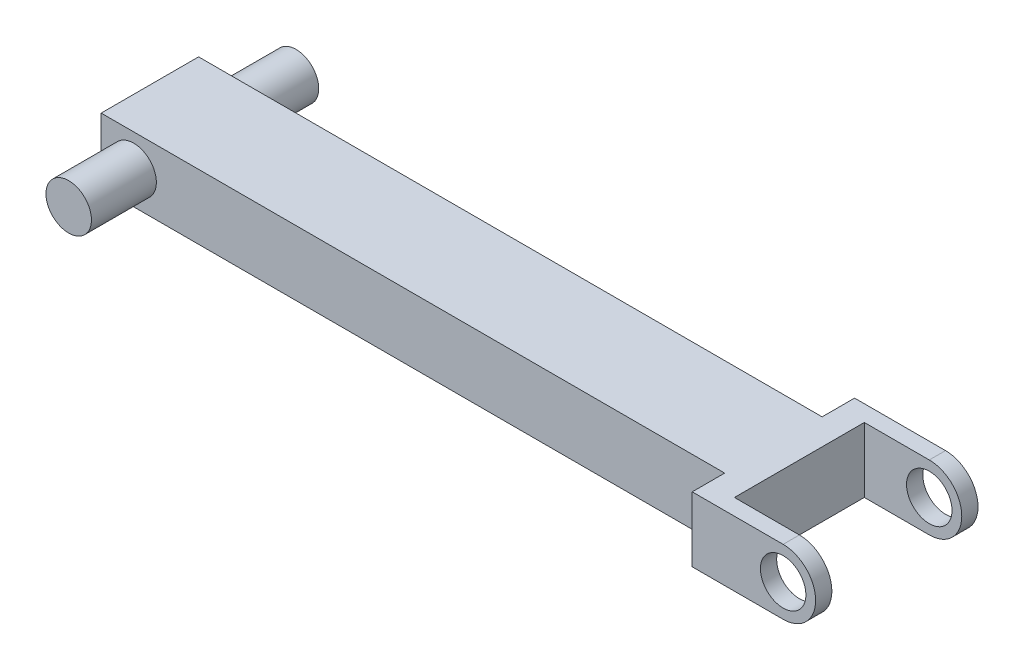
ISO-10303-21;
HEADER;
FILE_DESCRIPTION(('STEP AP214'),'2;1');
FILE_NAME('part.step','',(''),(''),'','','');
FILE_SCHEMA(('AUTOMOTIVE_DESIGN { 1 0 10303 214 1 1 1 1 }'));
ENDSEC;
DATA;
#1=APPLICATION_CONTEXT('core data for automotive mechanical design processes');
#2=APPLICATION_PROTOCOL_DEFINITION('international standard','automotive_design',2000,#1);
#3=PRODUCT_CONTEXT('',#1,'mechanical');
#4=PRODUCT('Part','Part','',(#3));
#5=PRODUCT_RELATED_PRODUCT_CATEGORY('part','',(#4));
#6=PRODUCT_DEFINITION_FORMATION('','',#4);
#7=PRODUCT_DEFINITION_CONTEXT('part definition',#1,'design');
#8=PRODUCT_DEFINITION('design','',#6,#7);
#9=PRODUCT_DEFINITION_SHAPE('','',#8);
#10=(LENGTH_UNIT() NAMED_UNIT(*) SI_UNIT(.MILLI.,.METRE.));
#11=(NAMED_UNIT(*) PLANE_ANGLE_UNIT() SI_UNIT($,.RADIAN.));
#12=(NAMED_UNIT(*) SI_UNIT($,.STERADIAN.) SOLID_ANGLE_UNIT());
#13=UNCERTAINTY_MEASURE_WITH_UNIT(LENGTH_MEASURE(1.E-05),#10,'distance_accuracy_value','');
#14=(GEOMETRIC_REPRESENTATION_CONTEXT(3) GLOBAL_UNCERTAINTY_ASSIGNED_CONTEXT((#13)) GLOBAL_UNIT_ASSIGNED_CONTEXT((#10,
#11,#12)) REPRESENTATION_CONTEXT('',''));
#15=CARTESIAN_POINT('',(0.,0.,0.));
#16=DIRECTION('',(0.,0.,1.));
#17=DIRECTION('',(1.,0.,0.));
#18=AXIS2_PLACEMENT_3D('',#15,#16,#17);
#19=CARTESIAN_POINT('',(0.,0.,0.));
#20=DIRECTION('',(0.,0.,1.));
#21=DIRECTION('',(1.,0.,0.));
#22=AXIS2_PLACEMENT_3D('',#19,#20,#21);
#23=PLANE('',#22);
#24=CARTESIAN_POINT('',(2.54,-2.54,0.));
#25=DIRECTION('',(0.,0.,1.));
#26=DIRECTION('',(1.,0.,0.));
#27=AXIS2_PLACEMENT_3D('',#24,#25,#26);
#28=CIRCLE('',#27,1.778);
#29=CARTESIAN_POINT('',(4.318,-2.54,0.));
#30=VERTEX_POINT('',#29);
#31=EDGE_CURVE('E11',#30,#30,#28,.F.);
#32=ORIENTED_EDGE('',*,*,#31,.F.);
#33=EDGE_LOOP('',(#32));
#34=FACE_BOUND('',#33,.T.);
#35=DIRECTION('',(0.,1.,0.));
#36=VECTOR('',#35,1.);
#37=CARTESIAN_POINT('',(48.768,0.,0.));
#38=LINE('',#37,#36);
#39=CARTESIAN_POINT('',(48.768,-5.08,0.));
#40=VERTEX_POINT('',#39);
#41=CARTESIAN_POINT('',(48.768,0.,0.));
#42=VERTEX_POINT('',#41);
#43=EDGE_CURVE('E177',#40,#42,#38,.T.);
#44=ORIENTED_EDGE('',*,*,#43,.F.);
#45=DIRECTION('',(1.,0.,0.));
#46=VECTOR('',#45,1.);
#47=CARTESIAN_POINT('',(0.,-5.08,0.));
#48=LINE('',#47,#46);
#49=CARTESIAN_POINT('',(0.,-5.08,0.));
#50=VERTEX_POINT('',#49);
#51=EDGE_CURVE('E267',#50,#40,#48,.T.);
#52=ORIENTED_EDGE('',*,*,#51,.F.);
#53=DIRECTION('',(0.,-1.,0.));
#54=VECTOR('',#53,1.);
#55=CARTESIAN_POINT('',(0.,0.,0.));
#56=LINE('',#55,#54);
#57=CARTESIAN_POINT('',(0.,0.,0.));
#58=VERTEX_POINT('',#57);
#59=EDGE_CURVE('E248',#58,#50,#56,.T.);
#60=ORIENTED_EDGE('',*,*,#59,.F.);
#61=DIRECTION('',(-1.,0.,0.));
#62=VECTOR('',#61,1.);
#63=CARTESIAN_POINT('',(0.,0.,0.));
#64=LINE('',#63,#62);
#65=EDGE_CURVE('E257',#42,#58,#64,.T.);
#66=ORIENTED_EDGE('',*,*,#65,.F.);
#67=EDGE_LOOP('',(#44,#52,#60,#66));
#68=FACE_BOUND('',#67,.T.);
#69=ADVANCED_FACE('F44',(#34,#68),#23,.F.);
#70=CARTESIAN_POINT('',(0.,0.,7.62));
#71=DIRECTION('',(0.,0.,1.));
#72=DIRECTION('',(1.,0.,0.));
#73=AXIS2_PLACEMENT_3D('',#70,#71,#72);
#74=PLANE('',#73);
#75=CARTESIAN_POINT('',(2.54,-2.54,7.62));
#76=DIRECTION('',(0.,0.,1.));
#77=DIRECTION('',(1.,0.,0.));
#78=AXIS2_PLACEMENT_3D('',#75,#76,#77);
#79=CIRCLE('',#78,1.778);
#80=CARTESIAN_POINT('',(4.318,-2.54,7.62));
#81=VERTEX_POINT('',#80);
#82=EDGE_CURVE('E243',#81,#81,#79,.T.);
#83=ORIENTED_EDGE('',*,*,#82,.F.);
#84=EDGE_LOOP('',(#83));
#85=FACE_BOUND('',#84,.T.);
#86=DIRECTION('',(1.,0.,0.));
#87=VECTOR('',#86,1.);
#88=CARTESIAN_POINT('',(0.,-5.08,7.62));
#89=LINE('',#88,#87);
#90=CARTESIAN_POINT('',(0.,-5.08,7.62));
#91=VERTEX_POINT('',#90);
#92=CARTESIAN_POINT('',(48.768,-5.08,7.62));
#93=VERTEX_POINT('',#92);
#94=EDGE_CURVE('E256',#91,#93,#89,.T.);
#95=ORIENTED_EDGE('',*,*,#94,.T.);
#96=DIRECTION('',(0.,-1.,0.));
#97=VECTOR('',#96,1.);
#98=CARTESIAN_POINT('',(48.768,0.,7.62));
#99=LINE('',#98,#97);
#100=CARTESIAN_POINT('',(48.768,0.,7.62));
#101=VERTEX_POINT('',#100);
#102=EDGE_CURVE('E215',#101,#93,#99,.T.);
#103=ORIENTED_EDGE('',*,*,#102,.F.);
#104=DIRECTION('',(-1.,0.,0.));
#105=VECTOR('',#104,1.);
#106=CARTESIAN_POINT('',(0.,0.,7.62));
#107=LINE('',#106,#105);
#108=CARTESIAN_POINT('',(0.,0.,7.62));
#109=VERTEX_POINT('',#108);
#110=EDGE_CURVE('E260',#101,#109,#107,.T.);
#111=ORIENTED_EDGE('',*,*,#110,.T.);
#112=DIRECTION('',(0.,-1.,0.));
#113=VECTOR('',#112,1.);
#114=CARTESIAN_POINT('',(0.,0.,7.62));
#115=LINE('',#114,#113);
#116=EDGE_CURVE('E252',#109,#91,#115,.T.);
#117=ORIENTED_EDGE('',*,*,#116,.T.);
#118=EDGE_LOOP('',(#95,#103,#111,#117));
#119=FACE_BOUND('',#118,.T.);
#120=ADVANCED_FACE('F314',(#85,#119),#74,.T.);
#121=CARTESIAN_POINT('',(0.,0.,7.62));
#122=DIRECTION('',(1.,0.,0.));
#123=DIRECTION('',(0.,0.,-1.));
#124=AXIS2_PLACEMENT_3D('',#121,#122,#123);
#125=PLANE('',#124);
#126=ORIENTED_EDGE('',*,*,#59,.T.);
#127=DIRECTION('',(0.,0.,-1.));
#128=VECTOR('',#127,1.);
#129=CARTESIAN_POINT('',(0.,-5.08,7.62));
#130=LINE('',#129,#128);
#131=EDGE_CURVE('E54',#91,#50,#130,.T.);
#132=ORIENTED_EDGE('',*,*,#131,.F.);
#133=ORIENTED_EDGE('',*,*,#116,.F.);
#134=DIRECTION('',(0.,0.,-1.));
#135=VECTOR('',#134,1.);
#136=CARTESIAN_POINT('',(0.,0.,7.62));
#137=LINE('',#136,#135);
#138=EDGE_CURVE('E263',#109,#58,#137,.T.);
#139=ORIENTED_EDGE('',*,*,#138,.T.);
#140=EDGE_LOOP('',(#126,#132,#133,#139));
#141=FACE_BOUND('',#140,.T.);
#142=ADVANCED_FACE('F46',(#141),#125,.F.);
#143=CARTESIAN_POINT('',(0.,-5.08,7.62));
#144=DIRECTION('',(0.,1.,0.));
#145=DIRECTION('',(0.,0.,1.));
#146=AXIS2_PLACEMENT_3D('',#143,#144,#145);
#147=PLANE('',#146);
#148=ORIENTED_EDGE('',*,*,#51,.T.);
#149=DIRECTION('',(0.,0.,1.));
#150=VECTOR('',#149,1.);
#151=CARTESIAN_POINT('',(48.768,-5.08,-2.54));
#152=LINE('',#151,#150);
#153=CARTESIAN_POINT('',(48.768,-5.08,-2.54));
#154=VERTEX_POINT('',#153);
#155=EDGE_CURVE('E191',#154,#40,#152,.T.);
#156=ORIENTED_EDGE('',*,*,#155,.F.);
#157=DIRECTION('',(-1.,0.,0.));
#158=VECTOR('',#157,1.);
#159=CARTESIAN_POINT('',(50.8,-5.08,-2.54));
#160=LINE('',#159,#158);
#161=CARTESIAN_POINT('',(55.88,-5.08,-2.54));
#162=VERTEX_POINT('',#161);
#163=EDGE_CURVE('E178',#162,#154,#160,.T.);
#164=ORIENTED_EDGE('',*,*,#163,.F.);
#165=DIRECTION('',(0.,0.,-1.));
#166=VECTOR('',#165,1.);
#167=CARTESIAN_POINT('',(55.88,-5.08,-1.27));
#168=LINE('',#167,#166);
#169=CARTESIAN_POINT('',(55.88,-5.08,-1.27));
#170=VERTEX_POINT('',#169);
#171=EDGE_CURVE('E158',#170,#162,#168,.T.);
#172=ORIENTED_EDGE('',*,*,#171,.F.);
#173=DIRECTION('',(-1.,0.,0.));
#174=VECTOR('',#173,1.);
#175=CARTESIAN_POINT('',(48.768,-5.08,-1.27));
#176=LINE('',#175,#174);
#177=CARTESIAN_POINT('',(50.8,-5.08,-1.27));
#178=VERTEX_POINT('',#177);
#179=EDGE_CURVE('E159',#170,#178,#176,.T.);
#180=ORIENTED_EDGE('',*,*,#179,.T.);
#181=DIRECTION('',(0.,0.,-1.));
#182=VECTOR('',#181,1.);
#183=CARTESIAN_POINT('',(50.8,-5.08,7.62));
#184=LINE('',#183,#182);
#185=CARTESIAN_POINT('',(50.8,-5.08,8.89));
#186=VERTEX_POINT('',#185);
#187=EDGE_CURVE('E278',#186,#178,#184,.T.);
#188=ORIENTED_EDGE('',*,*,#187,.F.);
#189=DIRECTION('',(1.,0.,0.));
#190=VECTOR('',#189,1.);
#191=CARTESIAN_POINT('',(50.8,-5.08,8.89));
#192=LINE('',#191,#190);
#193=CARTESIAN_POINT('',(55.88,-5.08,8.89));
#194=VERTEX_POINT('',#193);
#195=EDGE_CURVE('E69',#186,#194,#192,.T.);
#196=ORIENTED_EDGE('',*,*,#195,.T.);
#197=DIRECTION('',(0.,0.,1.));
#198=VECTOR('',#197,1.);
#199=CARTESIAN_POINT('',(55.88,-5.08,8.89));
#200=LINE('',#199,#198);
#201=CARTESIAN_POINT('',(55.88,-5.08,10.16));
#202=VERTEX_POINT('',#201);
#203=EDGE_CURVE('E207',#194,#202,#200,.T.);
#204=ORIENTED_EDGE('',*,*,#203,.T.);
#205=DIRECTION('',(1.,0.,0.));
#206=VECTOR('',#205,1.);
#207=CARTESIAN_POINT('',(50.8,-5.08,10.16));
#208=LINE('',#207,#206);
#209=CARTESIAN_POINT('',(48.768,-5.08,10.16));
#210=VERTEX_POINT('',#209);
#211=EDGE_CURVE('E225',#210,#202,#208,.T.);
#212=ORIENTED_EDGE('',*,*,#211,.F.);
#213=DIRECTION('',(0.,0.,-1.));
#214=VECTOR('',#213,1.);
#215=CARTESIAN_POINT('',(48.768,-5.08,10.16));
#216=LINE('',#215,#214);
#217=EDGE_CURVE('E228',#210,#93,#216,.T.);
#218=ORIENTED_EDGE('',*,*,#217,.T.);
#219=ORIENTED_EDGE('',*,*,#94,.F.);
#220=ORIENTED_EDGE('',*,*,#131,.T.);
#221=EDGE_LOOP('',(#148,#156,#164,#172,#180,#188,#196,#204,#212,#218,#219,#220));
#222=FACE_BOUND('',#221,.T.);
#223=ADVANCED_FACE('F286',(#222),#147,.F.);
#224=CARTESIAN_POINT('',(50.8,0.,7.62));
#225=DIRECTION('',(-1.,0.,0.));
#226=DIRECTION('',(0.,0.,1.));
#227=AXIS2_PLACEMENT_3D('',#224,#225,#226);
#228=PLANE('',#227);
#229=ORIENTED_EDGE('',*,*,#187,.T.);
#230=DIRECTION('',(0.,1.,0.));
#231=VECTOR('',#230,1.);
#232=CARTESIAN_POINT('',(50.8,0.,-1.27));
#233=LINE('',#232,#231);
#234=CARTESIAN_POINT('',(50.8,0.,-1.27));
#235=VERTEX_POINT('',#234);
#236=EDGE_CURVE('E173',#178,#235,#233,.T.);
#237=ORIENTED_EDGE('',*,*,#236,.T.);
#238=DIRECTION('',(0.,0.,-1.));
#239=VECTOR('',#238,1.);
#240=CARTESIAN_POINT('',(50.8,0.,7.62));
#241=LINE('',#240,#239);
#242=CARTESIAN_POINT('',(50.8,0.,8.89));
#243=VERTEX_POINT('',#242);
#244=EDGE_CURVE('E143',#243,#235,#241,.T.);
#245=ORIENTED_EDGE('',*,*,#244,.F.);
#246=DIRECTION('',(0.,-1.,0.));
#247=VECTOR('',#246,1.);
#248=CARTESIAN_POINT('',(50.8,0.,8.89));
#249=LINE('',#248,#247);
#250=EDGE_CURVE('E195',#243,#186,#249,.T.);
#251=ORIENTED_EDGE('',*,*,#250,.T.);
#252=EDGE_LOOP('',(#229,#237,#245,#251));
#253=FACE_BOUND('',#252,.T.);
#254=ADVANCED_FACE('F328',(#253),#228,.F.);
#255=CARTESIAN_POINT('',(0.,0.,7.62));
#256=DIRECTION('',(0.,-1.,0.));
#257=DIRECTION('',(0.,0.,-1.));
#258=AXIS2_PLACEMENT_3D('',#255,#256,#257);
#259=PLANE('',#258);
#260=ORIENTED_EDGE('',*,*,#244,.T.);
#261=DIRECTION('',(1.,0.,0.));
#262=VECTOR('',#261,1.);
#263=CARTESIAN_POINT('',(48.768,0.,-1.27));
#264=LINE('',#263,#262);
#265=CARTESIAN_POINT('',(55.88,0.,-1.27));
#266=VERTEX_POINT('',#265);
#267=EDGE_CURVE('E136',#235,#266,#264,.T.);
#268=ORIENTED_EDGE('',*,*,#267,.T.);
#269=DIRECTION('',(0.,0.,-1.));
#270=VECTOR('',#269,1.);
#271=CARTESIAN_POINT('',(55.88,0.,-1.27));
#272=LINE('',#271,#270);
#273=CARTESIAN_POINT('',(55.88,0.,-2.54));
#274=VERTEX_POINT('',#273);
#275=EDGE_CURVE('E139',#266,#274,#272,.T.);
#276=ORIENTED_EDGE('',*,*,#275,.T.);
#277=DIRECTION('',(1.,0.,0.));
#278=VECTOR('',#277,1.);
#279=CARTESIAN_POINT('',(50.8,0.,-2.54));
#280=LINE('',#279,#278);
#281=CARTESIAN_POINT('',(48.768,0.,-2.54));
#282=VERTEX_POINT('',#281);
#283=EDGE_CURVE('E184',#282,#274,#280,.T.);
#284=ORIENTED_EDGE('',*,*,#283,.F.);
#285=DIRECTION('',(0.,0.,1.));
#286=VECTOR('',#285,1.);
#287=CARTESIAN_POINT('',(48.768,0.,-2.54));
#288=LINE('',#287,#286);
#289=EDGE_CURVE('E61',#282,#42,#288,.T.);
#290=ORIENTED_EDGE('',*,*,#289,.T.);
#291=ORIENTED_EDGE('',*,*,#65,.T.);
#292=ORIENTED_EDGE('',*,*,#138,.F.);
#293=ORIENTED_EDGE('',*,*,#110,.F.);
#294=DIRECTION('',(0.,0.,-1.));
#295=VECTOR('',#294,1.);
#296=CARTESIAN_POINT('',(48.768,0.,10.16));
#297=LINE('',#296,#295);
#298=CARTESIAN_POINT('',(48.768,0.,10.16));
#299=VERTEX_POINT('',#298);
#300=EDGE_CURVE('E235',#299,#101,#297,.T.);
#301=ORIENTED_EDGE('',*,*,#300,.F.);
#302=DIRECTION('',(-1.,0.,0.));
#303=VECTOR('',#302,1.);
#304=CARTESIAN_POINT('',(50.8,0.,10.16));
#305=LINE('',#304,#303);
#306=CARTESIAN_POINT('',(55.88,0.,10.16));
#307=VERTEX_POINT('',#306);
#308=EDGE_CURVE('E219',#307,#299,#305,.T.);
#309=ORIENTED_EDGE('',*,*,#308,.F.);
#310=DIRECTION('',(0.,0.,1.));
#311=VECTOR('',#310,1.);
#312=CARTESIAN_POINT('',(55.88,0.,8.89));
#313=LINE('',#312,#311);
#314=CARTESIAN_POINT('',(55.88,0.,8.89));
#315=VERTEX_POINT('',#314);
#316=EDGE_CURVE('E211',#315,#307,#313,.T.);
#317=ORIENTED_EDGE('',*,*,#316,.F.);
#318=DIRECTION('',(-1.,0.,0.));
#319=VECTOR('',#318,1.);
#320=CARTESIAN_POINT('',(50.8,0.,8.89));
#321=LINE('',#320,#319);
#322=EDGE_CURVE('E204',#315,#243,#321,.T.);
#323=ORIENTED_EDGE('',*,*,#322,.T.);
#324=EDGE_LOOP('',(#260,#268,#276,#284,#290,#291,#292,#293,#301,#309,#317,#323));
#325=FACE_BOUND('',#324,.T.);
#326=ADVANCED_FACE('F138',(#325),#259,.F.);
#327=CARTESIAN_POINT('',(2.54,-2.54,12.7));
#328=DIRECTION('',(0.,0.,-1.));
#329=DIRECTION('',(-1.,0.,0.));
#330=AXIS2_PLACEMENT_3D('',#327,#328,#329);
#331=CYLINDRICAL_SURFACE('',#330,1.778);
#332=CARTESIAN_POINT('',(2.54,-2.54,12.7));
#333=DIRECTION('',(0.,0.,1.));
#334=DIRECTION('',(1.,0.,0.));
#335=AXIS2_PLACEMENT_3D('',#332,#333,#334);
#336=CIRCLE('',#335,1.778);
#337=CARTESIAN_POINT('',(4.318,-2.54,12.7));
#338=VERTEX_POINT('',#337);
#339=EDGE_CURVE('E244',#338,#338,#336,.T.);
#340=ORIENTED_EDGE('',*,*,#339,.F.);
#341=EDGE_LOOP('',(#340));
#342=FACE_BOUND('',#341,.T.);
#343=ORIENTED_EDGE('',*,*,#82,.T.);
#344=EDGE_LOOP('',(#343));
#345=FACE_BOUND('',#344,.T.);
#346=ADVANCED_FACE('F327',(#342,#345),#331,.T.);
#347=CARTESIAN_POINT('',(2.54,-2.54,12.7));
#348=DIRECTION('',(0.,0.,1.));
#349=DIRECTION('',(1.,0.,0.));
#350=AXIS2_PLACEMENT_3D('',#347,#348,#349);
#351=PLANE('',#350);
#352=ORIENTED_EDGE('',*,*,#339,.T.);
#353=EDGE_LOOP('',(#352));
#354=FACE_BOUND('',#353,.T.);
#355=ADVANCED_FACE('F551',(#354),#351,.T.);
#356=CARTESIAN_POINT('',(2.54,-2.54,-5.08));
#357=DIRECTION('',(0.,0.,1.));
#358=DIRECTION('',(1.,0.,0.));
#359=AXIS2_PLACEMENT_3D('',#356,#357,#358);
#360=CYLINDRICAL_SURFACE('',#359,1.778);
#361=CARTESIAN_POINT('',(2.54,-2.54,-5.08));
#362=DIRECTION('',(0.,0.,-1.));
#363=DIRECTION('',(-1.,0.,0.));
#364=AXIS2_PLACEMENT_3D('',#361,#362,#363);
#365=CIRCLE('',#364,1.778);
#366=CARTESIAN_POINT('',(0.762000000000001,-2.54,-5.08));
#367=VERTEX_POINT('',#366);
#368=EDGE_CURVE('E239',#367,#367,#365,.T.);
#369=ORIENTED_EDGE('',*,*,#368,.F.);
#370=EDGE_LOOP('',(#369));
#371=FACE_BOUND('',#370,.T.);
#372=ORIENTED_EDGE('',*,*,#31,.T.);
#373=EDGE_LOOP('',(#372));
#374=FACE_BOUND('',#373,.T.);
#375=ADVANCED_FACE('F559',(#371,#374),#360,.T.);
#376=CARTESIAN_POINT('',(2.54,-2.54,-5.08));
#377=DIRECTION('',(0.,0.,-1.));
#378=DIRECTION('',(-1.,0.,0.));
#379=AXIS2_PLACEMENT_3D('',#376,#377,#378);
#380=PLANE('',#379);
#381=ORIENTED_EDGE('',*,*,#368,.T.);
#382=EDGE_LOOP('',(#381));
#383=FACE_BOUND('',#382,.T.);
#384=ADVANCED_FACE('F350',(#383),#380,.T.);
#385=CARTESIAN_POINT('',(48.768,0.,10.16));
#386=DIRECTION('',(1.,0.,0.));
#387=DIRECTION('',(0.,0.,-1.));
#388=AXIS2_PLACEMENT_3D('',#385,#386,#387);
#389=PLANE('',#388);
#390=ORIENTED_EDGE('',*,*,#102,.T.);
#391=ORIENTED_EDGE('',*,*,#217,.F.);
#392=DIRECTION('',(0.,-1.,0.));
#393=VECTOR('',#392,1.);
#394=CARTESIAN_POINT('',(48.768,0.,10.16));
#395=LINE('',#394,#393);
#396=EDGE_CURVE('E222',#299,#210,#395,.T.);
#397=ORIENTED_EDGE('',*,*,#396,.F.);
#398=ORIENTED_EDGE('',*,*,#300,.T.);
#399=EDGE_LOOP('',(#390,#391,#397,#398));
#400=FACE_BOUND('',#399,.T.);
#401=ADVANCED_FACE('F355',(#400),#389,.F.);
#402=CARTESIAN_POINT('',(0.,0.,10.16));
#403=DIRECTION('',(0.,0.,-1.));
#404=DIRECTION('',(-1.,0.,0.));
#405=AXIS2_PLACEMENT_3D('',#402,#403,#404);
#406=PLANE('',#405);
#407=CARTESIAN_POINT('',(55.88,-2.54,10.16));
#408=DIRECTION('',(0.,0.,-1.));
#409=DIRECTION('',(-1.,0.,0.));
#410=AXIS2_PLACEMENT_3D('',#407,#408,#409);
#411=CIRCLE('',#410,1.778);
#412=CARTESIAN_POINT('',(54.102,-2.54,10.16));
#413=VERTEX_POINT('',#412);
#414=EDGE_CURVE('E171',#413,#413,#411,.T.);
#415=ORIENTED_EDGE('',*,*,#414,.T.);
#416=EDGE_LOOP('',(#415));
#417=FACE_BOUND('',#416,.T.);
#418=ORIENTED_EDGE('',*,*,#211,.T.);
#419=CARTESIAN_POINT('',(55.88,-2.54,10.16));
#420=DIRECTION('',(0.,0.,1.));
#421=DIRECTION('',(-1.,0.,0.));
#422=AXIS2_PLACEMENT_3D('',#419,#420,#421);
#423=CIRCLE('',#422,2.54);
#424=EDGE_CURVE('E194',#202,#307,#423,.T.);
#425=ORIENTED_EDGE('',*,*,#424,.T.);
#426=ORIENTED_EDGE('',*,*,#308,.T.);
#427=ORIENTED_EDGE('',*,*,#396,.T.);
#428=EDGE_LOOP('',(#418,#425,#426,#427));
#429=FACE_BOUND('',#428,.T.);
#430=ADVANCED_FACE('F360',(#417,#429),#406,.F.);
#431=CARTESIAN_POINT('',(55.88,-2.54,8.89));
#432=DIRECTION('',(0.,0.,1.));
#433=DIRECTION('',(1.,0.,0.));
#434=AXIS2_PLACEMENT_3D('',#431,#432,#433);
#435=CYLINDRICAL_SURFACE('',#434,2.54);
#436=ORIENTED_EDGE('',*,*,#424,.F.);
#437=ORIENTED_EDGE('',*,*,#203,.F.);
#438=CARTESIAN_POINT('',(55.88,-2.54,8.89));
#439=DIRECTION('',(0.,0.,1.));
#440=DIRECTION('',(-1.,0.,0.));
#441=AXIS2_PLACEMENT_3D('',#438,#439,#440);
#442=CIRCLE('',#441,2.54);
#443=EDGE_CURVE('E200',#194,#315,#442,.T.);
#444=ORIENTED_EDGE('',*,*,#443,.T.);
#445=ORIENTED_EDGE('',*,*,#316,.T.);
#446=EDGE_LOOP('',(#436,#437,#444,#445));
#447=FACE_BOUND('',#446,.T.);
#448=ADVANCED_FACE('F369',(#447),#435,.T.);
#449=CARTESIAN_POINT('',(55.88,-2.54,8.89));
#450=DIRECTION('',(0.,0.,-1.));
#451=DIRECTION('',(-1.,0.,0.));
#452=AXIS2_PLACEMENT_3D('',#449,#450,#451);
#453=PLANE('',#452);
#454=CARTESIAN_POINT('',(55.88,-2.54,8.89));
#455=DIRECTION('',(0.,0.,-1.));
#456=DIRECTION('',(-1.,0.,0.));
#457=AXIS2_PLACEMENT_3D('',#454,#455,#456);
#458=CIRCLE('',#457,1.778);
#459=CARTESIAN_POINT('',(54.102,-2.54,8.89));
#460=VERTEX_POINT('',#459);
#461=EDGE_CURVE('E482',#460,#460,#458,.T.);
#462=ORIENTED_EDGE('',*,*,#461,.F.);
#463=EDGE_LOOP('',(#462));
#464=FACE_BOUND('',#463,.T.);
#465=ORIENTED_EDGE('',*,*,#250,.F.);
#466=ORIENTED_EDGE('',*,*,#322,.F.);
#467=ORIENTED_EDGE('',*,*,#443,.F.);
#468=ORIENTED_EDGE('',*,*,#195,.F.);
#469=EDGE_LOOP('',(#465,#466,#467,#468));
#470=FACE_BOUND('',#469,.T.);
#471=ADVANCED_FACE('F309',(#464,#470),#453,.T.);
#472=CARTESIAN_POINT('',(48.768,0.,-2.54));
#473=DIRECTION('',(1.,0.,0.));
#474=DIRECTION('',(0.,0.,-1.));
#475=AXIS2_PLACEMENT_3D('',#472,#473,#474);
#476=PLANE('',#475);
#477=ORIENTED_EDGE('',*,*,#43,.T.);
#478=ORIENTED_EDGE('',*,*,#289,.F.);
#479=DIRECTION('',(0.,1.,0.));
#480=VECTOR('',#479,1.);
#481=CARTESIAN_POINT('',(48.768,0.,-2.54));
#482=LINE('',#481,#480);
#483=EDGE_CURVE('E181',#154,#282,#482,.T.);
#484=ORIENTED_EDGE('',*,*,#483,.F.);
#485=ORIENTED_EDGE('',*,*,#155,.T.);
#486=EDGE_LOOP('',(#477,#478,#484,#485));
#487=FACE_BOUND('',#486,.T.);
#488=ADVANCED_FACE('F296',(#487),#476,.F.);
#489=CARTESIAN_POINT('',(0.,0.,-2.54));
#490=DIRECTION('',(0.,0.,-1.));
#491=DIRECTION('',(-1.,0.,0.));
#492=AXIS2_PLACEMENT_3D('',#489,#490,#491);
#493=PLANE('',#492);
#494=CARTESIAN_POINT('',(55.88,-2.54,-2.54));
#495=DIRECTION('',(0.,0.,-1.));
#496=DIRECTION('',(-1.,0.,0.));
#497=AXIS2_PLACEMENT_3D('',#494,#495,#496);
#498=CIRCLE('',#497,1.778);
#499=CARTESIAN_POINT('',(54.102,-2.54,-2.54));
#500=VERTEX_POINT('',#499);
#501=EDGE_CURVE('E489',#500,#500,#498,.T.);
#502=ORIENTED_EDGE('',*,*,#501,.F.);
#503=EDGE_LOOP('',(#502));
#504=FACE_BOUND('',#503,.T.);
#505=ORIENTED_EDGE('',*,*,#283,.T.);
#506=CARTESIAN_POINT('',(55.88,-2.54,-2.54));
#507=DIRECTION('',(0.,0.,-1.));
#508=DIRECTION('',(1.,0.,0.));
#509=AXIS2_PLACEMENT_3D('',#506,#507,#508);
#510=CIRCLE('',#509,2.54);
#511=EDGE_CURVE('E149',#274,#162,#510,.T.);
#512=ORIENTED_EDGE('',*,*,#511,.T.);
#513=ORIENTED_EDGE('',*,*,#163,.T.);
#514=ORIENTED_EDGE('',*,*,#483,.T.);
#515=EDGE_LOOP('',(#505,#512,#513,#514));
#516=FACE_BOUND('',#515,.T.);
#517=ADVANCED_FACE('F299',(#504,#516),#493,.T.);
#518=CARTESIAN_POINT('',(55.88,-2.54,-1.27));
#519=DIRECTION('',(0.,0.,1.));
#520=DIRECTION('',(1.,0.,0.));
#521=AXIS2_PLACEMENT_3D('',#518,#519,#520);
#522=PLANE('',#521);
#523=CARTESIAN_POINT('',(55.88,-2.54,-1.27));
#524=DIRECTION('',(0.,0.,1.));
#525=DIRECTION('',(1.,0.,0.));
#526=AXIS2_PLACEMENT_3D('',#523,#524,#525);
#527=CIRCLE('',#526,1.778);
#528=CARTESIAN_POINT('',(57.658,-2.54,-1.27));
#529=VERTEX_POINT('',#528);
#530=EDGE_CURVE('E48',#529,#529,#527,.T.);
#531=ORIENTED_EDGE('',*,*,#530,.F.);
#532=EDGE_LOOP('',(#531));
#533=FACE_BOUND('',#532,.T.);
#534=ORIENTED_EDGE('',*,*,#236,.F.);
#535=ORIENTED_EDGE('',*,*,#179,.F.);
#536=CARTESIAN_POINT('',(55.88,-2.54,-1.27));
#537=DIRECTION('',(0.,0.,-1.));
#538=DIRECTION('',(1.,0.,0.));
#539=AXIS2_PLACEMENT_3D('',#536,#537,#538);
#540=CIRCLE('',#539,2.54);
#541=EDGE_CURVE('E148',#266,#170,#540,.T.);
#542=ORIENTED_EDGE('',*,*,#541,.F.);
#543=ORIENTED_EDGE('',*,*,#267,.F.);
#544=EDGE_LOOP('',(#534,#535,#542,#543));
#545=FACE_BOUND('',#544,.T.);
#546=ADVANCED_FACE('F161',(#533,#545),#522,.T.);
#547=CARTESIAN_POINT('',(55.88,-2.54,-1.27));
#548=DIRECTION('',(0.,0.,-1.));
#549=DIRECTION('',(-1.,0.,0.));
#550=AXIS2_PLACEMENT_3D('',#547,#548,#549);
#551=CYLINDRICAL_SURFACE('',#550,2.54);
#552=ORIENTED_EDGE('',*,*,#511,.F.);
#553=ORIENTED_EDGE('',*,*,#275,.F.);
#554=ORIENTED_EDGE('',*,*,#541,.T.);
#555=ORIENTED_EDGE('',*,*,#171,.T.);
#556=EDGE_LOOP('',(#552,#553,#554,#555));
#557=FACE_BOUND('',#556,.T.);
#558=ADVANCED_FACE('F153',(#557),#551,.T.);
#559=CARTESIAN_POINT('',(55.88,-2.54,12.7));
#560=DIRECTION('',(0.,0.,-1.));
#561=DIRECTION('',(-1.,0.,0.));
#562=AXIS2_PLACEMENT_3D('',#559,#560,#561);
#563=CYLINDRICAL_SURFACE('',#562,1.778);
#564=ORIENTED_EDGE('',*,*,#530,.T.);
#565=EDGE_LOOP('',(#564));
#566=FACE_BOUND('',#565,.T.);
#567=ORIENTED_EDGE('',*,*,#501,.T.);
#568=EDGE_LOOP('',(#567));
#569=FACE_BOUND('',#568,.T.);
#570=ADVANCED_FACE('F421',(#566,#569),#563,.F.);
#571=ORIENTED_EDGE('',*,*,#461,.T.);
#572=EDGE_LOOP('',(#571));
#573=FACE_BOUND('',#572,.T.);
#574=ORIENTED_EDGE('',*,*,#414,.F.);
#575=EDGE_LOOP('',(#574));
#576=FACE_BOUND('',#575,.T.);
#577=ADVANCED_FACE('F455',(#573,#576),#563,.F.);
#578=CLOSED_SHELL('',(#69,#120,#142,#223,#254,#326,#346,#355,#375,#384,#401,#430,#448,#471,#488,
#517,#546,#558,#570,#577));
#579=MANIFOLD_SOLID_BREP('B2',#578);
#580=ADVANCED_BREP_SHAPE_REPRESENTATION('',(#18,#579),#14);
#581=SHAPE_DEFINITION_REPRESENTATION(#9,#580);
ENDSEC;
END-ISO-10303-21;
